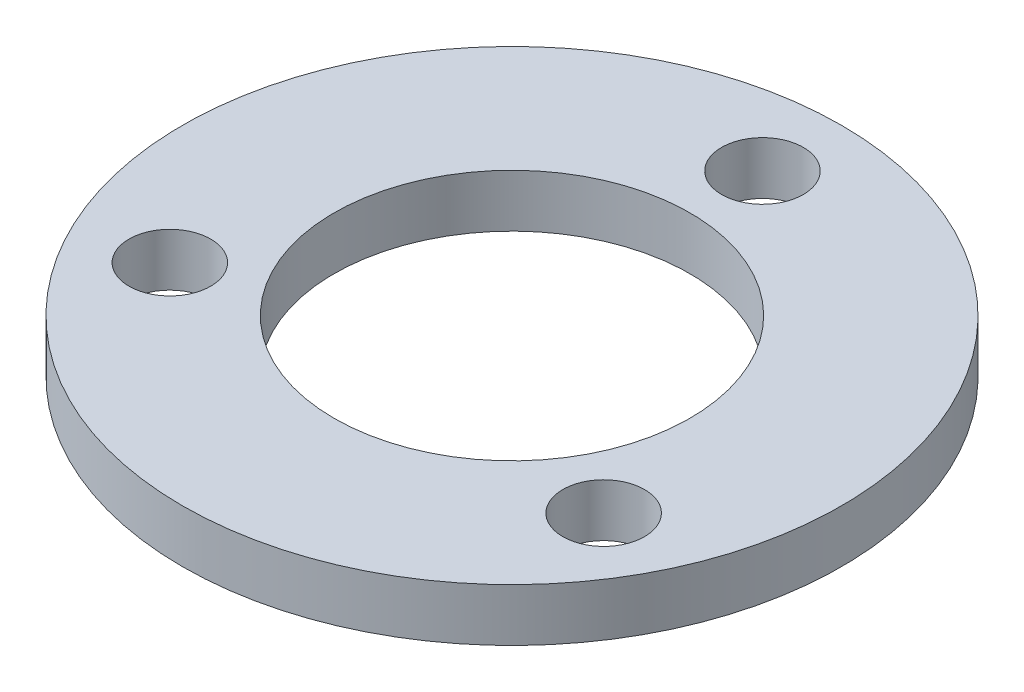
ISO-10303-21;
HEADER;
FILE_DESCRIPTION(('STEP AP214'),'2;1');
FILE_NAME('part.step','',(''),(''),'','','');
FILE_SCHEMA(('AUTOMOTIVE_DESIGN { 1 0 10303 214 1 1 1 1 }'));
ENDSEC;
DATA;
#1=APPLICATION_CONTEXT('core data for automotive mechanical design processes');
#2=APPLICATION_PROTOCOL_DEFINITION('international standard','automotive_design',2000,#1);
#3=PRODUCT_CONTEXT('',#1,'mechanical');
#4=PRODUCT('Part','Part','',(#3));
#5=PRODUCT_RELATED_PRODUCT_CATEGORY('part','',(#4));
#6=PRODUCT_DEFINITION_FORMATION('','',#4);
#7=PRODUCT_DEFINITION_CONTEXT('part definition',#1,'design');
#8=PRODUCT_DEFINITION('design','',#6,#7);
#9=PRODUCT_DEFINITION_SHAPE('','',#8);
#10=(LENGTH_UNIT() NAMED_UNIT(*) SI_UNIT(.MILLI.,.METRE.));
#11=(NAMED_UNIT(*) PLANE_ANGLE_UNIT() SI_UNIT($,.RADIAN.));
#12=(NAMED_UNIT(*) SI_UNIT($,.STERADIAN.) SOLID_ANGLE_UNIT());
#13=UNCERTAINTY_MEASURE_WITH_UNIT(LENGTH_MEASURE(1.E-05),#10,'distance_accuracy_value','');
#14=(GEOMETRIC_REPRESENTATION_CONTEXT(3) GLOBAL_UNCERTAINTY_ASSIGNED_CONTEXT((#13)) GLOBAL_UNIT_ASSIGNED_CONTEXT((#10,
#11,#12)) REPRESENTATION_CONTEXT('',''));
#15=CARTESIAN_POINT('',(0.,0.,0.));
#16=DIRECTION('',(0.,0.,1.));
#17=DIRECTION('',(1.,0.,0.));
#18=AXIS2_PLACEMENT_3D('',#15,#16,#17);
#19=CARTESIAN_POINT('',(0.,2.,0.));
#20=DIRECTION('',(0.,1.,0.));
#21=DIRECTION('',(0.,0.,1.));
#22=AXIS2_PLACEMENT_3D('',#19,#20,#21);
#23=PLANE('',#22);
#24=CARTESIAN_POINT('',(0.,2.,-9.5));
#25=DIRECTION('',(0.,1.,0.));
#26=DIRECTION('',(0.,0.,1.));
#27=AXIS2_PLACEMENT_3D('',#24,#25,#26);
#28=CIRCLE('',#27,1.55);
#29=CARTESIAN_POINT('',(0.,2.,-7.95));
#30=VERTEX_POINT('',#29);
#31=EDGE_CURVE('E76',#30,#30,#28,.T.);
#32=ORIENTED_EDGE('',*,*,#31,.F.);
#33=EDGE_LOOP('',(#32));
#34=FACE_BOUND('',#33,.T.);
#35=CARTESIAN_POINT('',(8.22724133595277,2.,4.74999999999965));
#36=DIRECTION('',(0.,1.,0.));
#37=DIRECTION('',(0.,0.,1.));
#38=AXIS2_PLACEMENT_3D('',#35,#36,#37);
#39=CIRCLE('',#38,1.55000000000052);
#40=CARTESIAN_POINT('',(8.22724133595277,2.,6.30000000000017));
#41=VERTEX_POINT('',#40);
#42=EDGE_CURVE('E68',#41,#41,#39,.T.);
#43=ORIENTED_EDGE('',*,*,#42,.F.);
#44=EDGE_LOOP('',(#43));
#45=FACE_BOUND('',#44,.T.);
#46=CARTESIAN_POINT('',(-8.22724133595156,2.,4.75000000000035));
#47=DIRECTION('',(0.,1.,0.));
#48=DIRECTION('',(0.,0.,1.));
#49=AXIS2_PLACEMENT_3D('',#46,#47,#48);
#50=CIRCLE('',#49,1.55000000000077);
#51=CARTESIAN_POINT('',(-8.22724133595156,2.,6.30000000000112));
#52=VERTEX_POINT('',#51);
#53=EDGE_CURVE('E60',#52,#52,#50,.T.);
#54=ORIENTED_EDGE('',*,*,#53,.F.);
#55=EDGE_LOOP('',(#54));
#56=FACE_BOUND('',#55,.T.);
#57=CARTESIAN_POINT('',(0.,2.,0.));
#58=DIRECTION('',(0.,1.,0.));
#59=DIRECTION('',(0.,0.,1.));
#60=AXIS2_PLACEMENT_3D('',#57,#58,#59);
#61=CIRCLE('',#60,12.5);
#62=CARTESIAN_POINT('',(0.,2.,12.5));
#63=VERTEX_POINT('',#62);
#64=EDGE_CURVE('E10',#63,#63,#61,.T.);
#65=ORIENTED_EDGE('',*,*,#64,.T.);
#66=EDGE_LOOP('',(#65));
#67=FACE_BOUND('',#66,.T.);
#68=CARTESIAN_POINT('',(0.,2.,0.));
#69=DIRECTION('',(0.,1.,0.));
#70=DIRECTION('',(0.,0.,1.));
#71=AXIS2_PLACEMENT_3D('',#68,#69,#70);
#72=CIRCLE('',#71,6.75);
#73=CARTESIAN_POINT('',(0.,2.,6.75));
#74=VERTEX_POINT('',#73);
#75=EDGE_CURVE('E50',#74,#74,#72,.T.);
#76=ORIENTED_EDGE('',*,*,#75,.F.);
#77=EDGE_LOOP('',(#76));
#78=FACE_BOUND('',#77,.T.);
#79=ADVANCED_FACE('F37',(#34,#45,#56,#67,#78),#23,.T.);
#80=CARTESIAN_POINT('',(0.,0.,0.));
#81=DIRECTION('',(0.,1.,0.));
#82=DIRECTION('',(0.,0.,1.));
#83=AXIS2_PLACEMENT_3D('',#80,#81,#82);
#84=PLANE('',#83);
#85=CARTESIAN_POINT('',(0.,0.,-9.5));
#86=DIRECTION('',(0.,1.,0.));
#87=DIRECTION('',(0.,0.,1.));
#88=AXIS2_PLACEMENT_3D('',#85,#86,#87);
#89=CIRCLE('',#88,1.55);
#90=CARTESIAN_POINT('',(0.,0.,-7.95));
#91=VERTEX_POINT('',#90);
#92=EDGE_CURVE('E56',#91,#91,#89,.T.);
#93=ORIENTED_EDGE('',*,*,#92,.T.);
#94=EDGE_LOOP('',(#93));
#95=FACE_BOUND('',#94,.T.);
#96=CARTESIAN_POINT('',(8.22724133595277,0.,4.74999999999965));
#97=DIRECTION('',(0.,1.,0.));
#98=DIRECTION('',(0.,0.,1.));
#99=AXIS2_PLACEMENT_3D('',#96,#97,#98);
#100=CIRCLE('',#99,1.55000000000052);
#101=CARTESIAN_POINT('',(8.22724133595277,0.,6.30000000000017));
#102=VERTEX_POINT('',#101);
#103=EDGE_CURVE('E72',#102,#102,#100,.T.);
#104=ORIENTED_EDGE('',*,*,#103,.T.);
#105=EDGE_LOOP('',(#104));
#106=FACE_BOUND('',#105,.T.);
#107=CARTESIAN_POINT('',(-8.22724133595156,0.,4.75000000000035));
#108=DIRECTION('',(0.,1.,0.));
#109=DIRECTION('',(0.,0.,1.));
#110=AXIS2_PLACEMENT_3D('',#107,#108,#109);
#111=CIRCLE('',#110,1.55000000000077);
#112=CARTESIAN_POINT('',(-8.22724133595156,0.,6.30000000000112));
#113=VERTEX_POINT('',#112);
#114=EDGE_CURVE('E64',#113,#113,#111,.T.);
#115=ORIENTED_EDGE('',*,*,#114,.T.);
#116=EDGE_LOOP('',(#115));
#117=FACE_BOUND('',#116,.T.);
#118=CARTESIAN_POINT('',(0.,0.,0.));
#119=DIRECTION('',(0.,1.,0.));
#120=DIRECTION('',(0.,0.,1.));
#121=AXIS2_PLACEMENT_3D('',#118,#119,#120);
#122=CIRCLE('',#121,12.5);
#123=CARTESIAN_POINT('',(0.,0.,12.5));
#124=VERTEX_POINT('',#123);
#125=EDGE_CURVE('E41',#124,#124,#122,.T.);
#126=ORIENTED_EDGE('',*,*,#125,.F.);
#127=EDGE_LOOP('',(#126));
#128=FACE_BOUND('',#127,.T.);
#129=CARTESIAN_POINT('',(0.,0.,0.));
#130=DIRECTION('',(0.,1.,0.));
#131=DIRECTION('',(0.,0.,1.));
#132=AXIS2_PLACEMENT_3D('',#129,#130,#131);
#133=CIRCLE('',#132,6.75);
#134=CARTESIAN_POINT('',(0.,0.,6.75));
#135=VERTEX_POINT('',#134);
#136=EDGE_CURVE('E52',#135,#135,#133,.T.);
#137=ORIENTED_EDGE('',*,*,#136,.T.);
#138=EDGE_LOOP('',(#137));
#139=FACE_BOUND('',#138,.T.);
#140=ADVANCED_FACE('F84',(#95,#106,#117,#128,#139),#84,.F.);
#141=CARTESIAN_POINT('',(0.,2.,0.));
#142=DIRECTION('',(0.,-1.,0.));
#143=DIRECTION('',(0.,0.,-1.));
#144=AXIS2_PLACEMENT_3D('',#141,#142,#143);
#145=CYLINDRICAL_SURFACE('',#144,12.5);
#146=ORIENTED_EDGE('',*,*,#64,.F.);
#147=EDGE_LOOP('',(#146));
#148=FACE_BOUND('',#147,.T.);
#149=ORIENTED_EDGE('',*,*,#125,.T.);
#150=EDGE_LOOP('',(#149));
#151=FACE_BOUND('',#150,.T.);
#152=ADVANCED_FACE('F39',(#148,#151),#145,.T.);
#153=CARTESIAN_POINT('',(0.,2.,0.));
#154=DIRECTION('',(0.,-1.,0.));
#155=DIRECTION('',(0.,0.,-1.));
#156=AXIS2_PLACEMENT_3D('',#153,#154,#155);
#157=CYLINDRICAL_SURFACE('',#156,6.75);
#158=ORIENTED_EDGE('',*,*,#75,.T.);
#159=EDGE_LOOP('',(#158));
#160=FACE_BOUND('',#159,.T.);
#161=ORIENTED_EDGE('',*,*,#136,.F.);
#162=EDGE_LOOP('',(#161));
#163=FACE_BOUND('',#162,.T.);
#164=ADVANCED_FACE('F103',(#160,#163),#157,.F.);
#165=CARTESIAN_POINT('',(-8.22724133595156,0.,4.75000000000035));
#166=DIRECTION('',(0.,1.,0.));
#167=DIRECTION('',(0.,0.,1.));
#168=AXIS2_PLACEMENT_3D('',#165,#166,#167);
#169=CYLINDRICAL_SURFACE('',#168,1.55000000000077);
#170=ORIENTED_EDGE('',*,*,#114,.F.);
#171=EDGE_LOOP('',(#170));
#172=FACE_BOUND('',#171,.T.);
#173=ORIENTED_EDGE('',*,*,#53,.T.);
#174=EDGE_LOOP('',(#173));
#175=FACE_BOUND('',#174,.T.);
#176=ADVANCED_FACE('F106',(#172,#175),#169,.F.);
#177=CARTESIAN_POINT('',(8.22724133595277,0.,4.74999999999965));
#178=DIRECTION('',(0.,1.,0.));
#179=DIRECTION('',(0.,0.,1.));
#180=AXIS2_PLACEMENT_3D('',#177,#178,#179);
#181=CYLINDRICAL_SURFACE('',#180,1.55000000000052);
#182=ORIENTED_EDGE('',*,*,#103,.F.);
#183=EDGE_LOOP('',(#182));
#184=FACE_BOUND('',#183,.T.);
#185=ORIENTED_EDGE('',*,*,#42,.T.);
#186=EDGE_LOOP('',(#185));
#187=FACE_BOUND('',#186,.T.);
#188=ADVANCED_FACE('F90',(#184,#187),#181,.F.);
#189=CARTESIAN_POINT('',(0.,0.,-9.5));
#190=DIRECTION('',(0.,1.,0.));
#191=DIRECTION('',(0.,0.,1.));
#192=AXIS2_PLACEMENT_3D('',#189,#190,#191);
#193=CYLINDRICAL_SURFACE('',#192,1.55);
#194=ORIENTED_EDGE('',*,*,#92,.F.);
#195=EDGE_LOOP('',(#194));
#196=FACE_BOUND('',#195,.T.);
#197=ORIENTED_EDGE('',*,*,#31,.T.);
#198=EDGE_LOOP('',(#197));
#199=FACE_BOUND('',#198,.T.);
#200=ADVANCED_FACE('F87',(#196,#199),#193,.F.);
#201=CLOSED_SHELL('',(#79,#140,#152,#164,#176,#188,#200));
#202=MANIFOLD_SOLID_BREP('B2',#201);
#203=ADVANCED_BREP_SHAPE_REPRESENTATION('',(#18,#202),#14);
#204=SHAPE_DEFINITION_REPRESENTATION(#9,#203);
ENDSEC;
END-ISO-10303-21;
